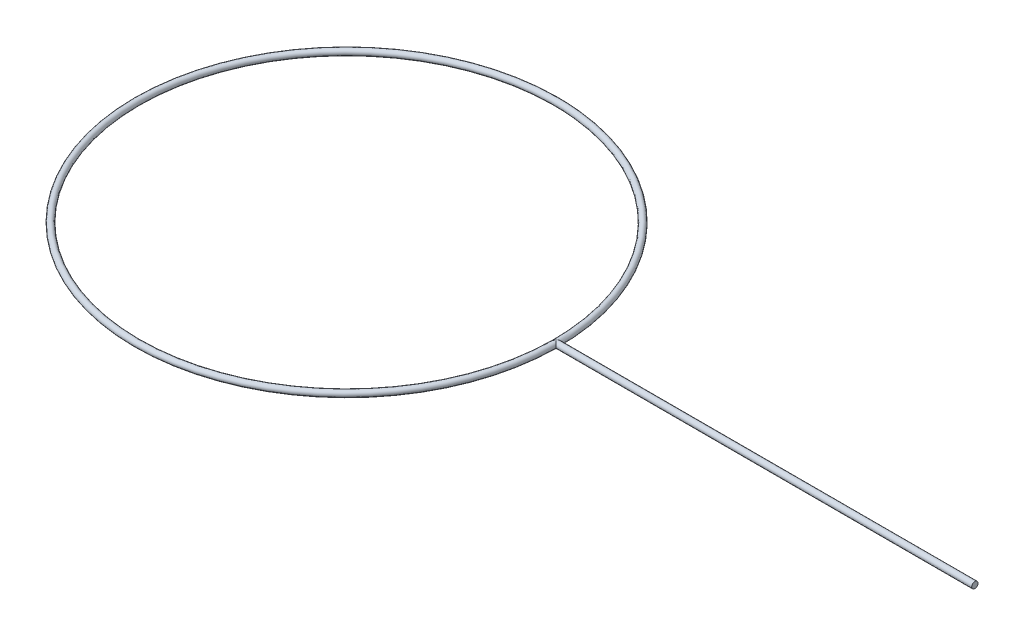
ISO-10303-21;
HEADER;
FILE_DESCRIPTION(('STEP AP214'),'2;1');
FILE_NAME('part.step','',(''),(''),'','','');
FILE_SCHEMA(('AUTOMOTIVE_DESIGN { 1 0 10303 214 1 1 1 1 }'));
ENDSEC;
DATA;
#1=APPLICATION_CONTEXT('core data for automotive mechanical design processes');
#2=APPLICATION_PROTOCOL_DEFINITION('international standard','automotive_design',2000,#1);
#3=PRODUCT_CONTEXT('',#1,'mechanical');
#4=PRODUCT('Part','Part','',(#3));
#5=PRODUCT_RELATED_PRODUCT_CATEGORY('part','',(#4));
#6=PRODUCT_DEFINITION_FORMATION('','',#4);
#7=PRODUCT_DEFINITION_CONTEXT('part definition',#1,'design');
#8=PRODUCT_DEFINITION('design','',#6,#7);
#9=PRODUCT_DEFINITION_SHAPE('','',#8);
#10=(LENGTH_UNIT() NAMED_UNIT(*) SI_UNIT(.MILLI.,.METRE.));
#11=(NAMED_UNIT(*) PLANE_ANGLE_UNIT() SI_UNIT($,.RADIAN.));
#12=(NAMED_UNIT(*) SI_UNIT($,.STERADIAN.) SOLID_ANGLE_UNIT());
#13=UNCERTAINTY_MEASURE_WITH_UNIT(LENGTH_MEASURE(1.E-05),#10,'distance_accuracy_value','');
#14=(GEOMETRIC_REPRESENTATION_CONTEXT(3) GLOBAL_UNCERTAINTY_ASSIGNED_CONTEXT((#13)) GLOBAL_UNIT_ASSIGNED_CONTEXT((#10,
#11,#12)) REPRESENTATION_CONTEXT('',''));
#15=CARTESIAN_POINT('',(0.,0.,0.));
#16=DIRECTION('',(0.,0.,1.));
#17=DIRECTION('',(1.,0.,0.));
#18=AXIS2_PLACEMENT_3D('',#15,#16,#17);
#19=CARTESIAN_POINT('',(-100.,-3.53883589099269E-13,0.));
#20=DIRECTION('',(0.,1.,0.));
#21=DIRECTION('',(-1.,0.,0.));
#22=AXIS2_PLACEMENT_3D('',#19,#20,#21);
#23=TOROIDAL_SURFACE('',#22,100.,1.5);
#24=CARTESIAN_POINT('',(0.,1.50000000000002,0.));
#25=CARTESIAN_POINT('',(0.00182569150858974,1.49999998994675,0.00182569101319961));
#26=CARTESIAN_POINT('',(0.00365141075230732,1.49999665711925,0.003651460270383));
#27=CARTESIAN_POINT('',(0.120133884662244,1.49957191231661,0.120140344706172));
#28=CARTESIAN_POINT('',(0.234871786825732,1.48604207622924,0.235083582805452));
#29=CARTESIAN_POINT('',(0.461193381089554,1.4318005685514,0.462192851493079));
#30=CARTESIAN_POINT('',(0.572770266866452,1.39103429506046,0.574352832995761));
#31=CARTESIAN_POINT('',(0.755550382918411,1.29694066117711,0.758376316922238));
#32=CARTESIAN_POINT('',(0.828732784579514,1.2511760728608,0.832141910480644));
#33=CARTESIAN_POINT('',(0.969201726689955,1.14430019096422,0.973874021524055));
#34=CARTESIAN_POINT('',(1.03650110834604,1.08322350831793,1.04185316046093));
#35=CARTESIAN_POINT('',(1.14624831303855,0.962267957908476,1.15280664521089));
#36=CARTESIAN_POINT('',(1.19067339444511,0.906003301675252,1.1977534570346));
#37=CARTESIAN_POINT('',(1.27272436942557,0.784173555892035,1.28081512815924));
#38=CARTESIAN_POINT('',(1.31035865884079,0.7186201321873,1.31893842328348));
#39=CARTESIAN_POINT('',(1.36995455948606,0.592699594525999,1.37933489202575));
#40=CARTESIAN_POINT('',(1.39354477561697,0.533899343966604,1.40325261421063));
#41=CARTESIAN_POINT('',(1.43360204744211,0.411541325408096,1.44387610675169));
#42=CARTESIAN_POINT('',(1.4500739337595,0.347986818197105,1.46058676793012));
#43=CARTESIAN_POINT('',(1.4748136392373,0.2172244682358,1.4856882231937));
#44=CARTESIAN_POINT('',(1.48302774747414,0.149995668672859,1.49402454796658));
#45=CARTESIAN_POINT('',(1.49035441304517,0.0145389286897787,1.50146011590537));
#46=CARTESIAN_POINT('',(1.48947052252791,-0.0536886114013605,1.50056296411469));
#47=CARTESIAN_POINT('',(1.47926524695191,-0.181571405847574,1.4902062820622));
#48=CARTESIAN_POINT('',(1.47083587750116,-0.241376976361936,1.48165197214675));
#49=CARTESIAN_POINT('',(1.44733710122105,-0.358257340311665,1.45781034040179));
#50=CARTESIAN_POINT('',(1.43226672270318,-0.41533173277564,1.44252203327823));
#51=CARTESIAN_POINT('',(1.39554168914359,-0.528089733001649,1.40527762871814));
#52=CARTESIAN_POINT('',(1.37362296937525,-0.583597307015513,1.38305417064699));
#53=CARTESIAN_POINT('',(1.32456084622517,-0.689688329637841,1.33333013470424));
#54=CARTESIAN_POINT('',(1.29741466876478,-0.740269142182605,1.30582675493666));
#55=CARTESIAN_POINT('',(1.22322563754679,-0.861903139947503,1.23069703707406));
#56=CARTESIAN_POINT('',(1.17330904769824,-0.92942761312837,1.18017816048361));
#57=CARTESIAN_POINT('',(1.06646057645728,-1.05226234616341,1.07213288334542));
#58=CARTESIAN_POINT('',(1.00951091404984,-1.10754061817098,1.01458872585434));
#59=CARTESIAN_POINT('',(0.868385638998074,-1.22509279128457,0.872122860460591));
#60=CARTESIAN_POINT('',(0.782039116429163,-1.28214944150471,0.7850575668907));
#61=CARTESIAN_POINT('',(0.60401310932661,-1.37595555517147,0.605797510001832));
#62=CARTESIAN_POINT('',(0.512330637270016,-1.41269351920369,0.513599874439074));
#63=CARTESIAN_POINT('',(0.351253795721602,-1.45988257100605,0.351847469382274));
#64=CARTESIAN_POINT('',(0.282505726606691,-1.474748252803,0.28288082497688));
#65=CARTESIAN_POINT('',(0.144328229146276,-1.49466646606651,0.144408598730748));
#66=CARTESIAN_POINT('',(0.0749002476266377,-1.49973658818988,0.0749042084254449));
#67=CARTESIAN_POINT('',(0.00365142787735164,-1.49999666403298,0.00365147765327158));
#68=CARTESIAN_POINT('',(0.00182570855496384,-1.49999999708484,0.00182570832201189));
#69=CARTESIAN_POINT('',(0.,-1.50000000000002,0.));
#70=B_SPLINE_CURVE_WITH_KNOTS('',3,(#24,#25,#26,#27,#28,#29,#30,#31,#32,#33,#34,#35,#36,#37,#38,
#39,#40,#41,#42,#43,#44,#45,#46,#47,#48,#49,#50,#51,#52,#53,#54,#55,#56,#57,#58,#59,#60,#61,#62,
#63,#64,#65,#66,#67,#68,#69),.UNSPECIFIED.,.F.,.F.,(4,2,2,2,2,2,2,2,2,2,2,2,2,2,2,2,2,2,2,2,2,2,
4),(0.,0.00774597314850721,0.494194245545214,0.981620656849759,1.32117314401438,
1.65996493129937,1.91295347468342,2.16562705820687,2.36798286120125,2.57020112553871,
2.7737263265368,2.97717206782788,3.15934250727374,3.34153961009642,3.53187603707636,
3.72231375049848,4.0146579258491,4.30775694737533,4.7113370385194,5.11514530376921,
5.41021627255469,5.70475686487295,5.71250283802146),.UNSPECIFIED.);
#71=CARTESIAN_POINT('',(0.,1.5,0.));
#72=VERTEX_POINT('',#71);
#73=CARTESIAN_POINT('',(0.,-1.5,0.));
#74=VERTEX_POINT('',#73);
#75=EDGE_CURVE('E12',#72,#74,#70,.T.);
#76=ORIENTED_EDGE('',*,*,#75,.F.);
#77=CARTESIAN_POINT('',(0.,-1.50000000000002,0.));
#78=CARTESIAN_POINT('',(0.00182569150891526,-1.49999998994676,-0.00182569101287409));
#79=CARTESIAN_POINT('',(0.0036514107529495,-1.49999665711925,-0.00365146026974082));
#80=CARTESIAN_POINT('',(0.12013388468331,-1.49957191231661,-0.120140344686656));
#81=CARTESIAN_POINT('',(0.234871786832666,-1.48604207622906,-0.235083582801623));
#82=CARTESIAN_POINT('',(0.461193381087236,-1.43180056855048,-0.462192851501525));
#83=CARTESIAN_POINT('',(0.572770266869052,-1.39103429505898,-0.574352833000757));
#84=CARTESIAN_POINT('',(0.755550382923249,-1.29694066117474,-0.758376316925427));
#85=CARTESIAN_POINT('',(0.828732784583304,-1.25117607285838,-0.832141910484024));
#86=CARTESIAN_POINT('',(0.969201726692468,-1.14430019096185,-0.973874021527026));
#87=CARTESIAN_POINT('',(1.03650110834832,-1.08322350831566,-1.0418531604633));
#88=CARTESIAN_POINT('',(1.14624831304041,-0.962267957906302,-1.15280664521266));
#89=CARTESIAN_POINT('',(1.19067339444681,-0.906003301673006,-1.19775345703628));
#90=CARTESIAN_POINT('',(1.27272436942698,-0.784173555889673,-1.28081512816069));
#91=CARTESIAN_POINT('',(1.31035865884207,-0.718620132184892,-1.31893842328479));
#92=CARTESIAN_POINT('',(1.36995455948711,-0.592699594523549,-1.3793348920268));
#93=CARTESIAN_POINT('',(1.39354477561791,-0.533899343964152,-1.40325261421156));
#94=CARTESIAN_POINT('',(1.4336020474428,-0.411541325405662,-1.44387610675239));
#95=CARTESIAN_POINT('',(1.45007393376006,-0.34798681819469,-1.46058676793069));
#96=CARTESIAN_POINT('',(1.47481363923762,-0.217224468233464,-1.48568822319404));
#97=CARTESIAN_POINT('',(1.48302774747437,-0.149995668670583,-1.49402454796681));
#98=CARTESIAN_POINT('',(1.4903544130452,-0.0145389286876498,-1.50146011590539));
#99=CARTESIAN_POINT('',(1.48947052252783,0.0536886114034029,-1.50056296411461));
#100=CARTESIAN_POINT('',(1.47926524695167,0.18157140584949,-1.49020628206196));
#101=CARTESIAN_POINT('',(1.47083587750085,0.241376976363813,-1.48165197214645));
#102=CARTESIAN_POINT('',(1.44733710122061,0.358257340313454,-1.45781034040135));
#103=CARTESIAN_POINT('',(1.43226672270269,0.41533173277738,-1.44252203327773));
#104=CARTESIAN_POINT('',(1.39554168914297,0.528089733003329,-1.40527762871751));
#105=CARTESIAN_POINT('',(1.37362296937454,0.583597307017175,-1.38305417064629));
#106=CARTESIAN_POINT('',(1.32456084622433,0.689688329639472,-1.33333013470339));
#107=CARTESIAN_POINT('',(1.29741466876389,0.740269142184222,-1.30582675493575));
#108=CARTESIAN_POINT('',(1.22322563754573,0.86190313994911,-1.23069703707293));
#109=CARTESIAN_POINT('',(1.17330904769704,0.92942761312996,-1.18017816048235));
#110=CARTESIAN_POINT('',(1.06646057645576,1.05226234616495,-1.07213288334394));
#111=CARTESIAN_POINT('',(1.00951091404813,1.10754061817248,-1.01458872585277));
#112=CARTESIAN_POINT('',(0.868385638996205,1.22509279128596,-0.87212286045857));
#113=CARTESIAN_POINT('',(0.782039116427422,1.28214944150602,-0.785057566888211));
#114=CARTESIAN_POINT('',(0.604013109323822,1.37595555517256,-0.605797509999751));
#115=CARTESIAN_POINT('',(0.512330637266052,1.41269351920464,-0.51359987443787));
#116=CARTESIAN_POINT('',(0.351253795720319,1.45988257100657,-0.351847469378986));
#117=CARTESIAN_POINT('',(0.282505726608151,1.47474825280332,-0.282880824971759));
#118=CARTESIAN_POINT('',(0.144328229142045,1.49466646606658,-0.144408598733145));
#119=CARTESIAN_POINT('',(0.0749002476139923,1.49973658818988,-0.0749042084371736));
#120=CARTESIAN_POINT('',(0.00365142787671743,1.49999666403297,-0.00365147765390596));
#121=CARTESIAN_POINT('',(0.00182570855463954,1.49999999708484,-0.00182570832233628));
#122=CARTESIAN_POINT('',(0.,1.50000000000002,0.));
#123=B_SPLINE_CURVE_WITH_KNOTS('',3,(#77,#78,#79,#80,#81,#82,#83,#84,#85,#86,#87,#88,#89,#90,
#91,#92,#93,#94,#95,#96,#97,#98,#99,#100,#101,#102,#103,#104,#105,#106,#107,#108,#109,#110,#111,
#112,#113,#114,#115,#116,#117,#118,#119,#120,#121,#122),.UNSPECIFIED.,.F.,.F.,(4,2,2,2,2,2,2,2,
2,2,2,2,2,2,2,2,2,2,2,2,2,2,4),(0.,0.00774597314850719,0.494194245548501,0.981620656856413,
1.32117314401943,1.6599649313028,1.91295347468659,2.16562705820979,2.36798286120394,
2.57020112554116,2.773726326539,2.97717206782983,3.15934250727563,3.34153961009827,
3.53187603707832,3.72231375050056,4.01465792585157,4.30775694737821,4.71133703852283,
5.11514530377313,5.41021627255662,5.70475686487295,5.71250283802145),.UNSPECIFIED.);
#124=EDGE_CURVE('E55',#74,#72,#123,.T.);
#125=ORIENTED_EDGE('',*,*,#124,.F.);
#126=EDGE_LOOP('',(#76,#125));
#127=FACE_BOUND('',#126,.T.);
#128=ADVANCED_FACE('F43',(#127),#23,.T.);
#129=CARTESIAN_POINT('',(200.,0.,0.));
#130=DIRECTION('',(-1.,0.,0.));
#131=DIRECTION('',(0.,0.,1.));
#132=AXIS2_PLACEMENT_3D('',#129,#130,#131);
#133=CYLINDRICAL_SURFACE('',#132,1.5);
#134=CARTESIAN_POINT('',(200.,0.,0.));
#135=DIRECTION('',(1.,0.,0.));
#136=DIRECTION('',(0.,0.,-1.));
#137=AXIS2_PLACEMENT_3D('',#134,#135,#136);
#138=CIRCLE('',#137,1.5);
#139=CARTESIAN_POINT('',(200.,0.,-1.5));
#140=VERTEX_POINT('',#139);
#141=EDGE_CURVE('E63',#140,#140,#138,.T.);
#142=ORIENTED_EDGE('',*,*,#141,.F.);
#143=EDGE_LOOP('',(#142));
#144=FACE_BOUND('',#143,.T.);
#145=ORIENTED_EDGE('',*,*,#124,.T.);
#146=ORIENTED_EDGE('',*,*,#75,.T.);
#147=EDGE_LOOP('',(#145,#146));
#148=FACE_BOUND('',#147,.T.);
#149=ADVANCED_FACE('F62',(#144,#148),#133,.T.);
#150=CARTESIAN_POINT('',(200.,0.,0.));
#151=DIRECTION('',(1.,0.,0.));
#152=DIRECTION('',(0.,0.,-1.));
#153=AXIS2_PLACEMENT_3D('',#150,#151,#152);
#154=PLANE('',#153);
#155=ORIENTED_EDGE('',*,*,#141,.T.);
#156=EDGE_LOOP('',(#155));
#157=FACE_BOUND('',#156,.T.);
#158=ADVANCED_FACE('F74',(#157),#154,.T.);
#159=CLOSED_SHELL('',(#128,#149,#158));
#160=MANIFOLD_SOLID_BREP('B2',#159);
#161=ADVANCED_BREP_SHAPE_REPRESENTATION('',(#18,#160),#14);
#162=SHAPE_DEFINITION_REPRESENTATION(#9,#161);
ENDSEC;
END-ISO-10303-21;
